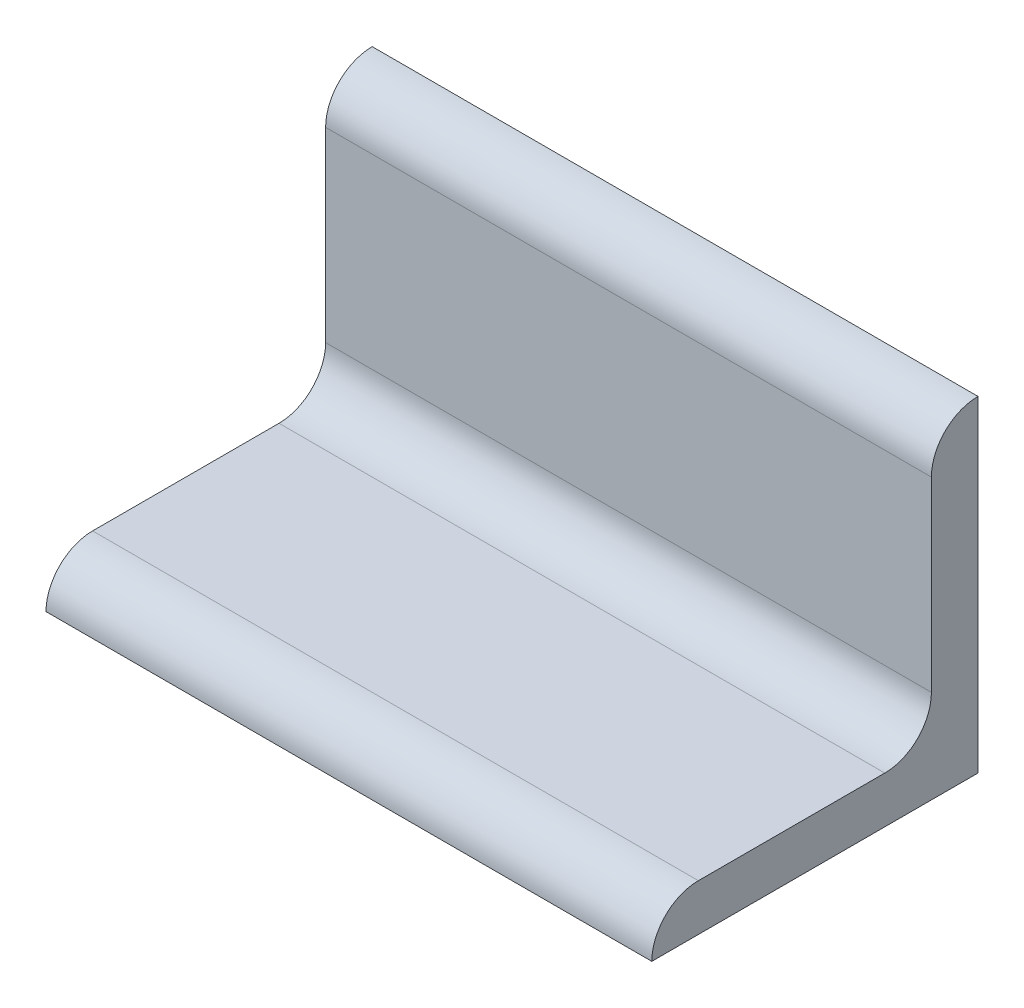
ISO-10303-21;
HEADER;
FILE_DESCRIPTION(('STEP AP214'),'2;1');
FILE_NAME('part.step','',(''),(''),'','','');
FILE_SCHEMA(('AUTOMOTIVE_DESIGN { 1 0 10303 214 1 1 1 1 }'));
ENDSEC;
DATA;
#1=APPLICATION_CONTEXT('core data for automotive mechanical design processes');
#2=APPLICATION_PROTOCOL_DEFINITION('international standard','automotive_design',2000,#1);
#3=PRODUCT_CONTEXT('',#1,'mechanical');
#4=PRODUCT('Part','Part','',(#3));
#5=PRODUCT_RELATED_PRODUCT_CATEGORY('part','',(#4));
#6=PRODUCT_DEFINITION_FORMATION('','',#4);
#7=PRODUCT_DEFINITION_CONTEXT('part definition',#1,'design');
#8=PRODUCT_DEFINITION('design','',#6,#7);
#9=PRODUCT_DEFINITION_SHAPE('','',#8);
#10=(LENGTH_UNIT() NAMED_UNIT(*) SI_UNIT(.MILLI.,.METRE.));
#11=(NAMED_UNIT(*) PLANE_ANGLE_UNIT() SI_UNIT($,.RADIAN.));
#12=(NAMED_UNIT(*) SI_UNIT($,.STERADIAN.) SOLID_ANGLE_UNIT());
#13=UNCERTAINTY_MEASURE_WITH_UNIT(LENGTH_MEASURE(1.E-05),#10,'distance_accuracy_value','');
#14=(GEOMETRIC_REPRESENTATION_CONTEXT(3) GLOBAL_UNCERTAINTY_ASSIGNED_CONTEXT((#13)) GLOBAL_UNIT_ASSIGNED_CONTEXT((#10,
#11,#12)) REPRESENTATION_CONTEXT('',''));
#15=CARTESIAN_POINT('',(0.,0.,0.));
#16=DIRECTION('',(0.,0.,1.));
#17=DIRECTION('',(1.,0.,0.));
#18=AXIS2_PLACEMENT_3D('',#15,#16,#17);
#19=CARTESIAN_POINT('',(32.7708333333333,35.,0.));
#20=DIRECTION('',(0.,0.,1.));
#21=DIRECTION('',(1.,0.,0.));
#22=AXIS2_PLACEMENT_3D('',#19,#20,#21);
#23=PLANE('',#22);
#24=DIRECTION('',(0.,1.,0.));
#25=VECTOR('',#24,1.);
#26=CARTESIAN_POINT('',(-32.2291666666667,35.,0.));
#27=LINE('',#26,#25);
#28=CARTESIAN_POINT('',(-32.2291666666667,0.,0.));
#29=VERTEX_POINT('',#28);
#30=CARTESIAN_POINT('',(-32.2291666666667,35.,0.));
#31=VERTEX_POINT('',#30);
#32=EDGE_CURVE('E151',#29,#31,#27,.T.);
#33=ORIENTED_EDGE('',*,*,#32,.T.);
#34=DIRECTION('',(-1.,0.,0.));
#35=VECTOR('',#34,1.);
#36=CARTESIAN_POINT('',(32.7708333333333,35.,0.));
#37=LINE('',#36,#35);
#38=CARTESIAN_POINT('',(32.7708333333333,35.,0.));
#39=VERTEX_POINT('',#38);
#40=EDGE_CURVE('E13',#39,#31,#37,.T.);
#41=ORIENTED_EDGE('',*,*,#40,.F.);
#42=DIRECTION('',(0.,1.,0.));
#43=VECTOR('',#42,1.);
#44=CARTESIAN_POINT('',(32.7708333333333,35.,0.));
#45=LINE('',#44,#43);
#46=CARTESIAN_POINT('',(32.7708333333333,0.,0.));
#47=VERTEX_POINT('',#46);
#48=EDGE_CURVE('E163',#47,#39,#45,.T.);
#49=ORIENTED_EDGE('',*,*,#48,.F.);
#50=DIRECTION('',(-1.,0.,0.));
#51=VECTOR('',#50,1.);
#52=CARTESIAN_POINT('',(32.7708333333333,0.,0.));
#53=LINE('',#52,#51);
#54=EDGE_CURVE('E147',#47,#29,#53,.T.);
#55=ORIENTED_EDGE('',*,*,#54,.T.);
#56=EDGE_LOOP('',(#33,#41,#49,#55));
#57=FACE_BOUND('',#56,.T.);
#58=ADVANCED_FACE('F61',(#57),#23,.F.);
#59=CARTESIAN_POINT('',(32.7708333333333,30.,0.));
#60=DIRECTION('',(-1.,0.,0.));
#61=DIRECTION('',(0.,0.,1.));
#62=AXIS2_PLACEMENT_3D('',#59,#60,#61);
#63=CYLINDRICAL_SURFACE('',#62,5.);
#64=CARTESIAN_POINT('',(-32.2291666666667,30.,0.));
#65=DIRECTION('',(1.,0.,0.));
#66=DIRECTION('',(0.,0.,-1.));
#67=AXIS2_PLACEMENT_3D('',#64,#65,#66);
#68=CIRCLE('',#67,5.);
#69=CARTESIAN_POINT('',(-32.2291666666667,30.,5.));
#70=VERTEX_POINT('',#69);
#71=EDGE_CURVE('E154',#31,#70,#68,.T.);
#72=ORIENTED_EDGE('',*,*,#71,.T.);
#73=DIRECTION('',(-1.,0.,0.));
#74=VECTOR('',#73,1.);
#75=CARTESIAN_POINT('',(32.7708333333333,30.,5.));
#76=LINE('',#75,#74);
#77=CARTESIAN_POINT('',(32.7708333333333,30.,5.));
#78=VERTEX_POINT('',#77);
#79=EDGE_CURVE('E69',#78,#70,#76,.T.);
#80=ORIENTED_EDGE('',*,*,#79,.F.);
#81=CARTESIAN_POINT('',(32.7708333333333,30.,0.));
#82=DIRECTION('',(1.,0.,0.));
#83=DIRECTION('',(0.,0.,-1.));
#84=AXIS2_PLACEMENT_3D('',#81,#82,#83);
#85=CIRCLE('',#84,5.);
#86=EDGE_CURVE('E117',#39,#78,#85,.T.);
#87=ORIENTED_EDGE('',*,*,#86,.F.);
#88=ORIENTED_EDGE('',*,*,#40,.T.);
#89=EDGE_LOOP('',(#72,#80,#87,#88));
#90=FACE_BOUND('',#89,.T.);
#91=ADVANCED_FACE('F188',(#90),#63,.T.);
#92=CARTESIAN_POINT('',(32.7708333333333,10.,5.));
#93=DIRECTION('',(0.,0.,-1.));
#94=DIRECTION('',(0.,1.,0.));
#95=AXIS2_PLACEMENT_3D('',#92,#93,#94);
#96=PLANE('',#95);
#97=DIRECTION('',(0.,-1.,0.));
#98=VECTOR('',#97,1.);
#99=CARTESIAN_POINT('',(-32.2291666666667,10.,5.));
#100=LINE('',#99,#98);
#101=CARTESIAN_POINT('',(-32.2291666666667,10.,5.));
#102=VERTEX_POINT('',#101);
#103=EDGE_CURVE('E156',#70,#102,#100,.T.);
#104=ORIENTED_EDGE('',*,*,#103,.T.);
#105=DIRECTION('',(-1.,0.,0.));
#106=VECTOR('',#105,1.);
#107=CARTESIAN_POINT('',(32.7708333333333,10.,5.));
#108=LINE('',#107,#106);
#109=CARTESIAN_POINT('',(32.7708333333333,10.,5.));
#110=VERTEX_POINT('',#109);
#111=EDGE_CURVE('E167',#110,#102,#108,.T.);
#112=ORIENTED_EDGE('',*,*,#111,.F.);
#113=DIRECTION('',(0.,-1.,0.));
#114=VECTOR('',#113,1.);
#115=CARTESIAN_POINT('',(32.7708333333333,10.,5.));
#116=LINE('',#115,#114);
#117=EDGE_CURVE('E175',#78,#110,#116,.T.);
#118=ORIENTED_EDGE('',*,*,#117,.F.);
#119=ORIENTED_EDGE('',*,*,#79,.T.);
#120=EDGE_LOOP('',(#104,#112,#118,#119));
#121=FACE_BOUND('',#120,.T.);
#122=ADVANCED_FACE('F173',(#121),#96,.F.);
#123=CARTESIAN_POINT('',(32.7708333333333,10.,10.));
#124=DIRECTION('',(-1.,0.,0.));
#125=DIRECTION('',(0.,0.,1.));
#126=AXIS2_PLACEMENT_3D('',#123,#124,#125);
#127=CYLINDRICAL_SURFACE('',#126,5.);
#128=CARTESIAN_POINT('',(-32.2291666666667,10.,10.));
#129=DIRECTION('',(-1.,0.,0.));
#130=DIRECTION('',(0.,0.,1.));
#131=AXIS2_PLACEMENT_3D('',#128,#129,#130);
#132=CIRCLE('',#131,5.);
#133=CARTESIAN_POINT('',(-32.2291666666667,5.,10.));
#134=VERTEX_POINT('',#133);
#135=EDGE_CURVE('E158',#102,#134,#132,.T.);
#136=ORIENTED_EDGE('',*,*,#135,.T.);
#137=DIRECTION('',(-1.,0.,0.));
#138=VECTOR('',#137,1.);
#139=CARTESIAN_POINT('',(32.7708333333333,5.,10.));
#140=LINE('',#139,#138);
#141=CARTESIAN_POINT('',(32.7708333333333,5.,10.));
#142=VERTEX_POINT('',#141);
#143=EDGE_CURVE('E142',#142,#134,#140,.T.);
#144=ORIENTED_EDGE('',*,*,#143,.F.);
#145=CARTESIAN_POINT('',(32.7708333333333,10.,10.));
#146=DIRECTION('',(-1.,0.,0.));
#147=DIRECTION('',(0.,0.,1.));
#148=AXIS2_PLACEMENT_3D('',#145,#146,#147);
#149=CIRCLE('',#148,5.);
#150=EDGE_CURVE('E133',#110,#142,#149,.T.);
#151=ORIENTED_EDGE('',*,*,#150,.F.);
#152=ORIENTED_EDGE('',*,*,#111,.T.);
#153=EDGE_LOOP('',(#136,#144,#151,#152));
#154=FACE_BOUND('',#153,.T.);
#155=ADVANCED_FACE('F181',(#154),#127,.F.);
#156=CARTESIAN_POINT('',(32.7708333333333,4.99999999999999,30.));
#157=DIRECTION('',(0.,-1.,0.));
#158=DIRECTION('',(0.,0.,-1.));
#159=AXIS2_PLACEMENT_3D('',#156,#157,#158);
#160=PLANE('',#159);
#161=DIRECTION('',(0.,0.,1.));
#162=VECTOR('',#161,1.);
#163=CARTESIAN_POINT('',(-32.2291666666667,4.99999999999999,30.));
#164=LINE('',#163,#162);
#165=CARTESIAN_POINT('',(-32.2291666666667,5.,30.));
#166=VERTEX_POINT('',#165);
#167=EDGE_CURVE('E141',#134,#166,#164,.T.);
#168=ORIENTED_EDGE('',*,*,#167,.T.);
#169=DIRECTION('',(-1.,0.,0.));
#170=VECTOR('',#169,1.);
#171=CARTESIAN_POINT('',(32.7708333333333,5.,30.));
#172=LINE('',#171,#170);
#173=CARTESIAN_POINT('',(32.7708333333333,5.,30.));
#174=VERTEX_POINT('',#173);
#175=EDGE_CURVE('E138',#174,#166,#172,.T.);
#176=ORIENTED_EDGE('',*,*,#175,.F.);
#177=DIRECTION('',(0.,0.,1.));
#178=VECTOR('',#177,1.);
#179=CARTESIAN_POINT('',(32.7708333333333,4.99999999999999,30.));
#180=LINE('',#179,#178);
#181=EDGE_CURVE('E127',#142,#174,#180,.T.);
#182=ORIENTED_EDGE('',*,*,#181,.F.);
#183=ORIENTED_EDGE('',*,*,#143,.T.);
#184=EDGE_LOOP('',(#168,#176,#182,#183));
#185=FACE_BOUND('',#184,.T.);
#186=ADVANCED_FACE('F139',(#185),#160,.F.);
#187=CARTESIAN_POINT('',(32.7708333333333,0.,30.));
#188=DIRECTION('',(-1.,0.,0.));
#189=DIRECTION('',(0.,0.,1.));
#190=AXIS2_PLACEMENT_3D('',#187,#188,#189);
#191=CYLINDRICAL_SURFACE('',#190,5.);
#192=CARTESIAN_POINT('',(-32.2291666666667,0.,30.));
#193=DIRECTION('',(1.,0.,0.));
#194=DIRECTION('',(0.,0.,1.));
#195=AXIS2_PLACEMENT_3D('',#192,#193,#194);
#196=CIRCLE('',#195,5.);
#197=CARTESIAN_POINT('',(-32.2291666666667,0.,35.));
#198=VERTEX_POINT('',#197);
#199=EDGE_CURVE('E103',#166,#198,#196,.T.);
#200=ORIENTED_EDGE('',*,*,#199,.T.);
#201=DIRECTION('',(-1.,0.,0.));
#202=VECTOR('',#201,1.);
#203=CARTESIAN_POINT('',(32.7708333333333,0.,35.));
#204=LINE('',#203,#202);
#205=CARTESIAN_POINT('',(32.7708333333333,0.,35.));
#206=VERTEX_POINT('',#205);
#207=EDGE_CURVE('E143',#206,#198,#204,.T.);
#208=ORIENTED_EDGE('',*,*,#207,.F.);
#209=CARTESIAN_POINT('',(32.7708333333333,0.,30.));
#210=DIRECTION('',(1.,0.,0.));
#211=DIRECTION('',(0.,0.,1.));
#212=AXIS2_PLACEMENT_3D('',#209,#210,#211);
#213=CIRCLE('',#212,5.);
#214=EDGE_CURVE('E131',#174,#206,#213,.T.);
#215=ORIENTED_EDGE('',*,*,#214,.F.);
#216=ORIENTED_EDGE('',*,*,#175,.T.);
#217=EDGE_LOOP('',(#200,#208,#215,#216));
#218=FACE_BOUND('',#217,.T.);
#219=ADVANCED_FACE('F145',(#218),#191,.T.);
#220=CARTESIAN_POINT('',(32.7708333333333,0.,0.));
#221=DIRECTION('',(0.,1.,0.));
#222=DIRECTION('',(0.,0.,1.));
#223=AXIS2_PLACEMENT_3D('',#220,#221,#222);
#224=PLANE('',#223);
#225=DIRECTION('',(0.,0.,-1.));
#226=VECTOR('',#225,1.);
#227=CARTESIAN_POINT('',(-32.2291666666667,0.,0.));
#228=LINE('',#227,#226);
#229=EDGE_CURVE('E109',#198,#29,#228,.T.);
#230=ORIENTED_EDGE('',*,*,#229,.T.);
#231=ORIENTED_EDGE('',*,*,#54,.F.);
#232=DIRECTION('',(0.,0.,-1.));
#233=VECTOR('',#232,1.);
#234=CARTESIAN_POINT('',(32.7708333333333,0.,0.));
#235=LINE('',#234,#233);
#236=EDGE_CURVE('E77',#206,#47,#235,.T.);
#237=ORIENTED_EDGE('',*,*,#236,.F.);
#238=ORIENTED_EDGE('',*,*,#207,.T.);
#239=EDGE_LOOP('',(#230,#231,#237,#238));
#240=FACE_BOUND('',#239,.T.);
#241=ADVANCED_FACE('F202',(#240),#224,.F.);
#242=CARTESIAN_POINT('',(32.7708333333333,0.,30.));
#243=DIRECTION('',(-1.,0.,0.));
#244=DIRECTION('',(0.,0.,1.));
#245=AXIS2_PLACEMENT_3D('',#242,#243,#244);
#246=PLANE('',#245);
#247=ORIENTED_EDGE('',*,*,#48,.T.);
#248=ORIENTED_EDGE('',*,*,#86,.T.);
#249=ORIENTED_EDGE('',*,*,#117,.T.);
#250=ORIENTED_EDGE('',*,*,#150,.T.);
#251=ORIENTED_EDGE('',*,*,#181,.T.);
#252=ORIENTED_EDGE('',*,*,#214,.T.);
#253=ORIENTED_EDGE('',*,*,#236,.T.);
#254=EDGE_LOOP('',(#247,#248,#249,#250,#251,#252,#253));
#255=FACE_BOUND('',#254,.T.);
#256=ADVANCED_FACE('F129',(#255),#246,.F.);
#257=CARTESIAN_POINT('',(-32.2291666666667,0.,30.));
#258=DIRECTION('',(-1.,0.,0.));
#259=DIRECTION('',(0.,0.,1.));
#260=AXIS2_PLACEMENT_3D('',#257,#258,#259);
#261=PLANE('',#260);
#262=ORIENTED_EDGE('',*,*,#32,.F.);
#263=ORIENTED_EDGE('',*,*,#229,.F.);
#264=ORIENTED_EDGE('',*,*,#199,.F.);
#265=ORIENTED_EDGE('',*,*,#167,.F.);
#266=ORIENTED_EDGE('',*,*,#135,.F.);
#267=ORIENTED_EDGE('',*,*,#103,.F.);
#268=ORIENTED_EDGE('',*,*,#71,.F.);
#269=EDGE_LOOP('',(#262,#263,#264,#265,#266,#267,#268));
#270=FACE_BOUND('',#269,.T.);
#271=ADVANCED_FACE('F179',(#270),#261,.T.);
#272=CLOSED_SHELL('',(#58,#91,#122,#155,#186,#219,#241,#256,#271));
#273=MANIFOLD_SOLID_BREP('B2',#272);
#274=ADVANCED_BREP_SHAPE_REPRESENTATION('',(#18,#273),#14);
#275=SHAPE_DEFINITION_REPRESENTATION(#9,#274);
ENDSEC;
END-ISO-10303-21;
